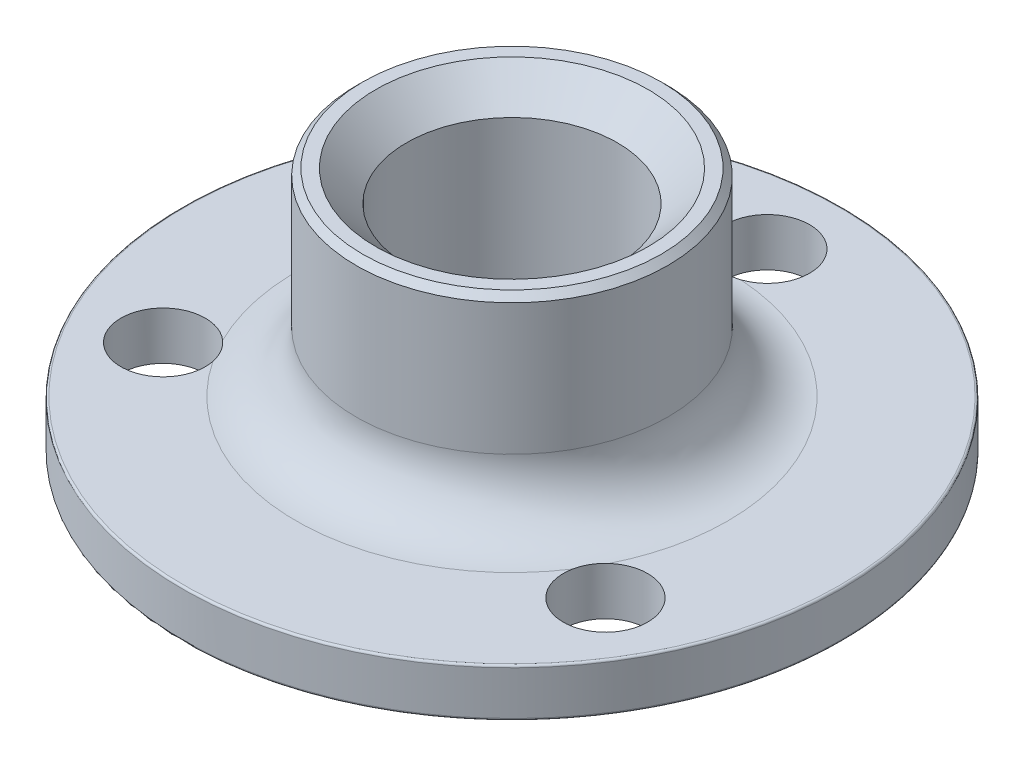
ISO-10303-21;
HEADER;
FILE_DESCRIPTION(('STEP AP214'),'2;1');
FILE_NAME('part.step','',(''),(''),'','','');
FILE_SCHEMA(('AUTOMOTIVE_DESIGN { 1 0 10303 214 1 1 1 1 }'));
ENDSEC;
DATA;
#1=APPLICATION_CONTEXT('core data for automotive mechanical design processes');
#2=APPLICATION_PROTOCOL_DEFINITION('international standard','automotive_design',2000,#1);
#3=PRODUCT_CONTEXT('',#1,'mechanical');
#4=PRODUCT('Part','Part','',(#3));
#5=PRODUCT_RELATED_PRODUCT_CATEGORY('part','',(#4));
#6=PRODUCT_DEFINITION_FORMATION('','',#4);
#7=PRODUCT_DEFINITION_CONTEXT('part definition',#1,'design');
#8=PRODUCT_DEFINITION('design','',#6,#7);
#9=PRODUCT_DEFINITION_SHAPE('','',#8);
#10=(LENGTH_UNIT() NAMED_UNIT(*) SI_UNIT(.MILLI.,.METRE.));
#11=(NAMED_UNIT(*) PLANE_ANGLE_UNIT() SI_UNIT($,.RADIAN.));
#12=(NAMED_UNIT(*) SI_UNIT($,.STERADIAN.) SOLID_ANGLE_UNIT());
#13=UNCERTAINTY_MEASURE_WITH_UNIT(LENGTH_MEASURE(1.E-05),#10,'distance_accuracy_value','');
#14=(GEOMETRIC_REPRESENTATION_CONTEXT(3) GLOBAL_UNCERTAINTY_ASSIGNED_CONTEXT((#13)) GLOBAL_UNIT_ASSIGNED_CONTEXT((#10,
#11,#12)) REPRESENTATION_CONTEXT('',''));
#15=CARTESIAN_POINT('',(0.,0.,0.));
#16=DIRECTION('',(0.,0.,1.));
#17=DIRECTION('',(1.,0.,0.));
#18=AXIS2_PLACEMENT_3D('',#15,#16,#17);
#19=CARTESIAN_POINT('',(0.,-0.717549999999995,0.));
#20=DIRECTION('',(0.,-1.,0.));
#21=DIRECTION('',(1.,0.,0.));
#22=AXIS2_PLACEMENT_3D('',#19,#20,#21);
#23=TOROIDAL_SURFACE('',#22,10.39495,2.88925);
#24=CARTESIAN_POINT('',(0.,-0.717549999999996,0.));
#25=DIRECTION('',(0.,-1.,0.));
#26=DIRECTION('',(1.,0.,0.));
#27=AXIS2_PLACEMENT_3D('',#24,#25,#26);
#28=CIRCLE('',#27,7.5057);
#29=CARTESIAN_POINT('',(7.5057,-0.717549999999995,0.));
#30=VERTEX_POINT('',#29);
#31=EDGE_CURVE('E101',#30,#30,#28,.T.);
#32=ORIENTED_EDGE('',*,*,#31,.T.);
#33=EDGE_LOOP('',(#32));
#34=FACE_BOUND('',#33,.T.);
#35=CARTESIAN_POINT('',(-0.699038911202562,-3.60670297944473,-10.3951500000001));
#36=CARTESIAN_POINT('',(-0.644625123533835,-3.60688135179927,-10.375207064648));
#37=CARTESIAN_POINT('',(-0.589355165590195,-3.60677808494333,-10.3576044859045));
#38=CARTESIAN_POINT('',(-0.477522624445641,-3.60630061340747,-10.3271830594659));
#39=CARTESIAN_POINT('',(-0.420960212432454,-3.60592644440985,-10.314363582094));
#40=CARTESIAN_POINT('',(-0.308585232071366,-3.60520984307511,-10.2939041640021));
#41=CARTESIAN_POINT('',(-0.252797786844004,-3.60486680787456,-10.2861260342643));
#42=CARTESIAN_POINT('',(-0.140769027838509,-3.6043595646744,-10.2752258010875));
#43=CARTESIAN_POINT('',(-0.0845277082129204,-3.60419535898244,-10.2721037577314));
#44=CARTESIAN_POINT('',(0.032584120620781,-3.60411234873903,-10.2704756651495));
#45=CARTESIAN_POINT('',(0.0934605160561535,-3.60421450381666,-10.2723640852411));
#46=CARTESIAN_POINT('',(0.214803724141637,-3.60466061490249,-10.281594074507));
#47=CARTESIAN_POINT('',(0.275270480870036,-3.60500460327867,-10.2889363736592));
#48=CARTESIAN_POINT('',(0.397221790344512,-3.60577101481073,-10.3093398557612));
#49=CARTESIAN_POINT('',(0.458677073452452,-3.60619559407451,-10.3225763792749));
#50=CARTESIAN_POINT('',(0.580103368203233,-3.6067558685005,-10.3546748685427));
#51=CARTESIAN_POINT('',(0.640074334559854,-3.60689155485934,-10.3735370057047));
#52=CARTESIAN_POINT('',(0.699038911202559,-3.60670297944473,-10.3951500000001));
#53=B_SPLINE_CURVE_WITH_KNOTS('',3,(#35,#36,#37,#38,#39,#40,#41,#42,#43,#44,#45,#46,#47,#48,#49,
#50,#51,#52),.UNSPECIFIED.,.F.,.F.,(4,2,2,2,2,2,2,2,4),(0.,0.173804306273878,0.347585723806384,
0.516375876102302,0.685168206475681,0.867635683791728,1.05012758798126,1.23845418499346,
1.42678652074876),.UNSPECIFIED.);
#54=CARTESIAN_POINT('',(-0.641738668822516,-3.60679999999999,-10.3751220225806));
#55=VERTEX_POINT('',#54);
#56=CARTESIAN_POINT('',(0.641738668822513,-3.60679999999999,-10.3751220225806));
#57=VERTEX_POINT('',#56);
#58=EDGE_CURVE('E62',#55,#57,#53,.T.);
#59=ORIENTED_EDGE('',*,*,#58,.F.);
#60=CARTESIAN_POINT('',(0.,-3.60679999999999,0.));
#61=DIRECTION('',(0.,-1.,0.));
#62=DIRECTION('',(1.,0.,0.));
#63=AXIS2_PLACEMENT_3D('',#60,#61,#62);
#64=CIRCLE('',#63,10.39495);
#65=CARTESIAN_POINT('',(-9.30598857332948,-3.60679999999999,4.63179902149922));
#66=VERTEX_POINT('',#65);
#67=EDGE_CURVE('E93',#66,#55,#64,.T.);
#68=ORIENTED_EDGE('',*,*,#67,.F.);
#69=CARTESIAN_POINT('',(-10.39515,-1.32516775605289,8.16690269868048));
#70=CARTESIAN_POINT('',(-10.3743685263919,-1.40887795772418,8.16420394407488));
#71=CARTESIAN_POINT('',(-10.3495590759793,-1.49147110282293,8.16070361178508));
#72=CARTESIAN_POINT('',(-10.2928273135894,-1.65398677668887,8.15127057625675));
#73=CARTESIAN_POINT('',(-10.2609091879206,-1.73391084555336,8.14533930288244));
#74=CARTESIAN_POINT('',(-10.1553445419097,-1.97032623566462,8.12253989195984));
#75=CARTESIAN_POINT('',(-10.0722202867577,-2.12221681988929,8.10068108393669));
#76=CARTESIAN_POINT('',(-9.89409294298795,-2.40236950083914,8.03801533549606));
#77=CARTESIAN_POINT('',(-9.80003785591703,-2.53148517610506,7.99836029846631));
#78=CARTESIAN_POINT('',(-9.65334647658652,-2.71211641950909,7.92049626430788));
#79=CARTESIAN_POINT('',(-9.60361147506809,-2.77005814471357,7.89154826226693));
#80=CARTESIAN_POINT('',(-9.50329825637222,-2.88118801003743,7.82684919751274));
#81=CARTESIAN_POINT('',(-9.45272053652818,-2.93437884369589,7.79110202606314));
#82=CARTESIAN_POINT('',(-9.33564558040954,-3.05175940821069,7.69945255960604));
#83=CARTESIAN_POINT('',(-9.26927787948656,-3.11395966661616,7.64076872000779));
#84=CARTESIAN_POINT('',(-9.1407062797776,-3.22748996719885,7.50982989655418));
#85=CARTESIAN_POINT('',(-9.078500511376,-3.27882491300018,7.43758106261758));
#86=CARTESIAN_POINT('',(-8.9618510286017,-3.36977350450899,7.27964104418815));
#87=CARTESIAN_POINT('',(-8.90745403068033,-3.4093180148702,7.19387491330998));
#88=CARTESIAN_POINT('',(-8.81081402695962,-3.47607962265982,7.01139647318019));
#89=CARTESIAN_POINT('',(-8.76856797662764,-3.50329980904505,6.91468691438294));
#90=CARTESIAN_POINT('',(-8.70235376140697,-3.54471437370805,6.7227710068073));
#91=CARTESIAN_POINT('',(-8.67708369615472,-3.55985989361741,6.62821135234147));
#92=CARTESIAN_POINT('',(-8.64037834928259,-3.58283784921619,6.4355912464614));
#93=CARTESIAN_POINT('',(-8.62894724234016,-3.59066807800319,6.33752974785593));
#94=CARTESIAN_POINT('',(-8.62027787629318,-3.60151611748984,6.13637080949568));
#95=CARTESIAN_POINT('',(-8.62366099076061,-3.60431614919233,6.03323593099274));
#96=CARTESIAN_POINT('',(-8.64600290017203,-3.60703722425548,5.82863120593506));
#97=CARTESIAN_POINT('',(-8.6649664949229,-3.60695738010082,5.72716188230677));
#98=CARTESIAN_POINT('',(-8.72039317176198,-3.60603401670753,5.51944985979781));
#99=CARTESIAN_POINT('',(-8.75825487624305,-3.60512361996353,5.41357800224657));
#100=CARTESIAN_POINT('',(-8.85089959844967,-3.60411056584059,5.20951107544351));
#101=CARTESIAN_POINT('',(-8.90568417494079,-3.60400798289244,5.11131671441032));
#102=CARTESIAN_POINT('',(-9.03185945658104,-3.60476163756627,4.92353080198515));
#103=CARTESIAN_POINT('',(-9.10354423467646,-3.6056360194151,4.83413673903364));
#104=CARTESIAN_POINT('',(-9.26094352914523,-3.60686946626325,4.66859748607653));
#105=CARTESIAN_POINT('',(-9.34666525325203,-3.60722826558954,4.59245914431782));
#106=CARTESIAN_POINT('',(-9.52976346270985,-3.60460190775242,4.45557897569437));
#107=CARTESIAN_POINT('',(-9.62715394628218,-3.60161269760421,4.39485591930367));
#108=CARTESIAN_POINT('',(-9.830318760787,-3.58870516752587,4.29086926018729));
#109=CARTESIAN_POINT('',(-9.93607516765113,-3.57880132386916,4.24756947860823));
#110=CARTESIAN_POINT('',(-10.1017136846212,-3.55565885793833,4.19534514641158));
#111=CARTESIAN_POINT('',(-10.1600957412204,-3.54610385426763,4.17979462768295));
#112=CARTESIAN_POINT('',(-10.2773957530172,-3.52362197045826,4.15401592405193));
#113=CARTESIAN_POINT('',(-10.3363138330337,-3.51069428449495,4.14378901285424));
#114=CARTESIAN_POINT('',(-10.3951499999999,-3.49587885705814,4.13622230131954));
#115=B_SPLINE_CURVE_WITH_KNOTS('',3,(#69,#70,#71,#72,#73,#74,#75,#76,#77,#78,#79,#80,#81,#82,
#83,#84,#85,#86,#87,#88,#89,#90,#91,#92,#93,#94,#95,#96,#97,#98,#99,#100,#101,#102,#103,#104,
#105,#106,#107,#108,#109,#110,#111,#112,#113,#114),.UNSPECIFIED.,.F.,.F.,(4,2,2,2,2,2,2,2,2,2,2,
2,2,2,2,2,2,2,2,2,2,2,4),(0.,0.258627882036687,0.517103858605673,1.03786271538546,
1.52891790137242,1.77354429615412,2.01803110667861,2.34141143931967,2.6646455145142,
2.98973925179036,3.31475146271423,3.61054046718633,3.90641867752321,4.21482351508023,
4.52332339713642,4.85909161277833,5.19489076525419,5.53703159455512,5.87934866146125,
6.22208057392144,6.56409709617972,6.74730811894538,6.93056295591203),.UNSPECIFIED.);
#116=CARTESIAN_POINT('',(-8.66424990450697,-3.60679999999999,5.74332300108143));
#117=VERTEX_POINT('',#116);
#118=EDGE_CURVE('E69',#117,#66,#115,.T.);
#119=ORIENTED_EDGE('',*,*,#118,.F.);
#120=CARTESIAN_POINT('',(8.66424990450697,-3.60679999999999,5.74332300108142));
#121=VERTEX_POINT('',#120);
#122=EDGE_CURVE('E92',#121,#117,#64,.T.);
#123=ORIENTED_EDGE('',*,*,#122,.F.);
#124=CARTESIAN_POINT('',(10.3951499999999,-3.49587885705814,4.13622230131953));
#125=CARTESIAN_POINT('',(10.344212732184,-3.5087039660119,4.14277216739067));
#126=CARTESIAN_POINT('',(10.2931905507332,-3.52012028444383,4.15132217902308));
#127=CARTESIAN_POINT('',(10.1914940820546,-3.5403799039437,4.17241233570946));
#128=CARTESIAN_POINT('',(10.1408195962564,-3.54922481830435,4.18494996855382));
#129=CARTESIAN_POINT('',(10.0405042201078,-3.56456601766516,4.21394603478827));
#130=CARTESIAN_POINT('',(9.99085962507414,-3.57107300908092,4.23038600715351));
#131=CARTESIAN_POINT('',(9.89280416822146,-3.58211061723898,4.26712541199733));
#132=CARTESIAN_POINT('',(9.8443934492594,-3.58664100610213,4.28742528909062));
#133=CARTESIAN_POINT('',(9.70178078335549,-3.59776212221341,4.35386974824209));
#134=CARTESIAN_POINT('',(9.60993603097394,-3.60191883771331,4.40563483130743));
#135=CARTESIAN_POINT('',(9.43528286072819,-3.60651485254248,4.52280440284422));
#136=CARTESIAN_POINT('',(9.35248383279635,-3.60695032455331,4.58822286308421));
#137=CARTESIAN_POINT('',(9.19366157764279,-3.60656071808991,4.73509673059334));
#138=CARTESIAN_POINT('',(9.1182768715149,-3.60566373059596,4.8172447388765));
#139=CARTESIAN_POINT('',(8.98194600679819,-3.60439790671641,4.99273903051551));
#140=CARTESIAN_POINT('',(8.92099899408791,-3.60402903908118,5.0860846509379));
#141=CARTESIAN_POINT('',(8.81369364237139,-3.60434295325588,5.28419947549487));
#142=CARTESIAN_POINT('',(8.76778732198609,-3.60505521729785,5.38921388891031));
#143=CARTESIAN_POINT('',(8.69423564622362,-3.60646995416851,5.60549309245051));
#144=CARTESIAN_POINT('',(8.66659700373702,-3.60717242330511,5.71676016398391));
#145=CARTESIAN_POINT('',(8.63037341724441,-3.60600720963472,5.94247184649286));
#146=CARTESIAN_POINT('',(8.62180658567028,-3.6041370863698,6.05691937361253));
#147=CARTESIAN_POINT('',(8.62401977570595,-3.59436606016821,6.2853758125004));
#148=CARTESIAN_POINT('',(8.63478942539688,-3.58646839166022,6.39938492655908));
#149=CARTESIAN_POINT('',(8.6741874105825,-3.56156727580656,6.61846462869247));
#150=CARTESIAN_POINT('',(8.70207296982064,-3.54494652117421,6.72371019351652));
#151=CARTESIAN_POINT('',(8.77322961835944,-3.50032224030122,6.9262522542291));
#152=CARTESIAN_POINT('',(8.81648795511609,-3.47232814610717,7.02355525687351));
#153=CARTESIAN_POINT('',(8.91066565406238,-3.40692337804083,7.19842123719789));
#154=CARTESIAN_POINT('',(8.96051953253198,-3.37061086952056,7.27697606905527));
#155=CARTESIAN_POINT('',(9.06726029724287,-3.28776655909767,7.42312737215979));
#156=CARTESIAN_POINT('',(9.12414883704129,-3.24123235249445,7.49072125827993));
#157=CARTESIAN_POINT('',(9.24307830755844,-3.13771145845192,7.61567335413502));
#158=CARTESIAN_POINT('',(9.30520346054631,-3.08052235582484,7.67278149852262));
#159=CARTESIAN_POINT('',(9.43054021293056,-2.95761820695505,7.77536593569752));
#160=CARTESIAN_POINT('',(9.49375234949411,-2.89189883366034,7.82083629009017));
#161=CARTESIAN_POINT('',(9.64898872227926,-2.71957930495926,7.92059360600571));
#162=CARTESIAN_POINT('',(9.74019372016429,-2.6085574817745,7.96854346510643));
#163=CARTESIAN_POINT('',(9.91324725312969,-2.37331370740081,8.04579547931258));
#164=CARTESIAN_POINT('',(9.99507000054968,-2.24905710395733,8.07504720421365));
#165=CARTESIAN_POINT('',(10.1404463925903,-1.99545569761011,8.11877803325811));
#166=CARTESIAN_POINT('',(10.2046597243861,-1.86659638259092,8.13386631493012));
#167=CARTESIAN_POINT('',(10.2871928288979,-1.66747516400894,8.15022733960612));
#168=CARTESIAN_POINT('',(10.3123750531051,-1.60024792693086,8.15463359811615));
#169=CARTESIAN_POINT('',(10.357689576495,-1.46399131315497,8.16184939924092));
#170=CARTESIAN_POINT('',(10.3778190847497,-1.39496096362508,8.16465806048334));
#171=CARTESIAN_POINT('',(10.39515,-1.32516775605294,8.16690269868046));
#172=B_SPLINE_CURVE_WITH_KNOTS('',3,(#124,#125,#126,#127,#128,#129,#130,#131,#132,#133,#134,
#135,#136,#137,#138,#139,#140,#141,#142,#143,#144,#145,#146,#147,#148,#149,#150,#151,#152,#153,
#154,#155,#156,#157,#158,#159,#160,#161,#162,#163,#164,#165,#166,#167,#168,#169,#170,#171),
.UNSPECIFIED.,.F.,.F.,(4,2,2,2,2,2,2,2,2,2,2,2,2,2,2,2,2,2,2,2,2,2,2,4),(0.,0.158727786543946,
0.317355771676596,0.475247778749525,0.633157984116389,0.948162735978176,1.2634914329336,
1.59646710980105,1.92942308319307,2.27162321487548,2.6139490262837,2.95659980487533,
3.29906684350124,3.6276304268744,3.95592208293744,4.25412596213601,4.55240007042064,
4.85705875715399,5.16187259299259,5.6138054550301,6.06695212584552,6.49957106629925,
6.71515288139804,6.93085351493704),.UNSPECIFIED.);
#173=CARTESIAN_POINT('',(9.30598857332949,-3.60679999999999,4.63179902149921));
#174=VERTEX_POINT('',#173);
#175=EDGE_CURVE('E144',#174,#121,#172,.T.);
#176=ORIENTED_EDGE('',*,*,#175,.F.);
#177=EDGE_CURVE('E103',#57,#174,#64,.T.);
#178=ORIENTED_EDGE('',*,*,#177,.F.);
#179=EDGE_LOOP('',(#59,#68,#119,#123,#176,#178));
#180=FACE_BOUND('',#179,.T.);
#181=ADVANCED_FACE('F47',(#34,#180),#23,.F.);
#182=CARTESIAN_POINT('',(0.,-3.02894999999999,0.));
#183=DIRECTION('',(0.,-1.,0.));
#184=DIRECTION('',(1.,0.,0.));
#185=AXIS2_PLACEMENT_3D('',#182,#183,#184);
#186=TOROIDAL_SURFACE('',#185,7.97018969676203,2.88925);
#187=CARTESIAN_POINT('',(0.,-3.02895,0.));
#188=DIRECTION('',(0.,-1.,0.));
#189=DIRECTION('',(1.,0.,0.));
#190=AXIS2_PLACEMENT_3D('',#187,#188,#189);
#191=CIRCLE('',#190,5.08093969676203);
#192=CARTESIAN_POINT('',(5.08093969676203,-3.02894999999999,0.));
#193=VERTEX_POINT('',#192);
#194=EDGE_CURVE('E243',#193,#193,#191,.T.);
#195=ORIENTED_EDGE('',*,*,#194,.F.);
#196=EDGE_LOOP('',(#195));
#197=FACE_BOUND('',#196,.T.);
#198=CARTESIAN_POINT('',(0.,-5.91819999999999,0.));
#199=DIRECTION('',(0.,-1.,0.));
#200=DIRECTION('',(1.,0.,0.));
#201=AXIS2_PLACEMENT_3D('',#198,#199,#200);
#202=CIRCLE('',#201,7.97018969676203);
#203=CARTESIAN_POINT('',(7.97018969676203,-5.91819999999999,0.));
#204=VERTEX_POINT('',#203);
#205=EDGE_CURVE('E111',#204,#204,#202,.T.);
#206=ORIENTED_EDGE('',*,*,#205,.T.);
#207=EDGE_LOOP('',(#206));
#208=FACE_BOUND('',#207,.T.);
#209=ADVANCED_FACE('F183',(#197,#208),#186,.T.);
#210=CARTESIAN_POINT('',(0.,-5.9182,0.));
#211=DIRECTION('',(0.,-1.,0.));
#212=DIRECTION('',(1.,0.,0.));
#213=AXIS2_PLACEMENT_3D('',#210,#211,#212);
#214=CYLINDRICAL_SURFACE('',#213,5.08093969676203);
#215=CARTESIAN_POINT('',(0.,4.43762964622238,0.));
#216=DIRECTION('',(0.,-1.,0.));
#217=DIRECTION('',(1.,0.,0.));
#218=AXIS2_PLACEMENT_3D('',#215,#216,#217);
#219=CIRCLE('',#218,5.08093969676203);
#220=CARTESIAN_POINT('',(5.08093969676202,4.43762964622239,0.));
#221=VERTEX_POINT('',#220);
#222=EDGE_CURVE('E247',#221,#221,#219,.T.);
#223=ORIENTED_EDGE('',*,*,#222,.F.);
#224=EDGE_LOOP('',(#223));
#225=FACE_BOUND('',#224,.T.);
#226=ORIENTED_EDGE('',*,*,#194,.T.);
#227=EDGE_LOOP('',(#226));
#228=FACE_BOUND('',#227,.T.);
#229=ADVANCED_FACE('F189',(#225,#228),#214,.F.);
#230=CARTESIAN_POINT('',(0.,4.43762964622238,0.));
#231=DIRECTION('',(0.,1.,0.));
#232=DIRECTION('',(-1.,0.,0.));
#233=AXIS2_PLACEMENT_3D('',#230,#231,#232);
#234=CONICAL_SURFACE('',#233,5.08093969676203,0.785398163397451);
#235=CARTESIAN_POINT('',(0.,5.91820000000001,0.));
#236=DIRECTION('',(0.,-1.,0.));
#237=DIRECTION('',(1.,0.,0.));
#238=AXIS2_PLACEMENT_3D('',#235,#236,#237);
#239=CIRCLE('',#238,6.56151005053966);
#240=CARTESIAN_POINT('',(6.56151005053965,5.91820000000001,0.));
#241=VERTEX_POINT('',#240);
#242=EDGE_CURVE('E107',#241,#241,#239,.T.);
#243=ORIENTED_EDGE('',*,*,#242,.F.);
#244=EDGE_LOOP('',(#243));
#245=FACE_BOUND('',#244,.T.);
#246=ORIENTED_EDGE('',*,*,#222,.T.);
#247=EDGE_LOOP('',(#246));
#248=FACE_BOUND('',#247,.T.);
#249=ADVANCED_FACE('F204',(#245,#248),#234,.F.);
#250=CARTESIAN_POINT('',(-6.56151005053966,5.91820000000001,0.));
#251=DIRECTION('',(0.,-1.,0.));
#252=DIRECTION('',(1.,0.,0.));
#253=AXIS2_PLACEMENT_3D('',#250,#251,#252);
#254=PLANE('',#253);
#255=CARTESIAN_POINT('',(0.,5.91820000000001,0.));
#256=DIRECTION('',(0.,-1.,0.));
#257=DIRECTION('',(1.,0.,0.));
#258=AXIS2_PLACEMENT_3D('',#255,#256,#257);
#259=CIRCLE('',#258,7.19097001684587);
#260=CARTESIAN_POINT('',(7.19097001684587,5.91820000000001,0.));
#261=VERTEX_POINT('',#260);
#262=EDGE_CURVE('E11',#261,#261,#259,.F.);
#263=ORIENTED_EDGE('',*,*,#262,.T.);
#264=EDGE_LOOP('',(#263));
#265=FACE_BOUND('',#264,.T.);
#266=ORIENTED_EDGE('',*,*,#242,.T.);
#267=EDGE_LOOP('',(#266));
#268=FACE_BOUND('',#267,.T.);
#269=ADVANCED_FACE('F196',(#265,#268),#254,.F.);
#270=CARTESIAN_POINT('',(0.,-5.9182,0.));
#271=DIRECTION('',(0.,-1.,0.));
#272=DIRECTION('',(1.,0.,0.));
#273=AXIS2_PLACEMENT_3D('',#270,#271,#272);
#274=CYLINDRICAL_SURFACE('',#273,7.5057);
#275=CARTESIAN_POINT('',(0.,5.60347001684587,0.));
#276=DIRECTION('',(0.,-1.,0.));
#277=DIRECTION('',(1.,0.,0.));
#278=AXIS2_PLACEMENT_3D('',#275,#276,#277);
#279=CIRCLE('',#278,7.5057);
#280=CARTESIAN_POINT('',(7.5057,5.60347001684587,0.));
#281=VERTEX_POINT('',#280);
#282=EDGE_CURVE('E56',#281,#281,#279,.T.);
#283=ORIENTED_EDGE('',*,*,#282,.T.);
#284=EDGE_LOOP('',(#283));
#285=FACE_BOUND('',#284,.T.);
#286=ORIENTED_EDGE('',*,*,#31,.F.);
#287=EDGE_LOOP('',(#286));
#288=FACE_BOUND('',#287,.T.);
#289=ADVANCED_FACE('F194',(#285,#288),#274,.T.);
#290=CARTESIAN_POINT('',(-10.39495,-3.6068,0.));
#291=DIRECTION('',(0.,-1.,0.));
#292=DIRECTION('',(1.,0.,0.));
#293=AXIS2_PLACEMENT_3D('',#290,#291,#292);
#294=PLANE('',#293);
#295=CARTESIAN_POINT('',(0.,-3.60679999999999,0.));
#296=DIRECTION('',(0.,-1.,0.));
#297=DIRECTION('',(1.,0.,0.));
#298=AXIS2_PLACEMENT_3D('',#295,#296,#297);
#299=CIRCLE('',#298,15.77578125);
#300=CARTESIAN_POINT('',(15.77578125,-3.60679999999999,0.));
#301=VERTEX_POINT('',#300);
#302=EDGE_CURVE('E230',#301,#301,#299,.F.);
#303=ORIENTED_EDGE('',*,*,#302,.T.);
#304=EDGE_LOOP('',(#303));
#305=FACE_BOUND('',#304,.T.);
#306=CARTESIAN_POINT('',(0.,-3.60679999999999,-12.303125));
#307=DIRECTION('',(0.,-1.,0.));
#308=DIRECTION('',(1.,0.,0.));
#309=AXIS2_PLACEMENT_3D('',#306,#307,#308);
#310=CIRCLE('',#309,2.032);
#311=EDGE_CURVE('E118',#57,#55,#310,.F.);
#312=ORIENTED_EDGE('',*,*,#311,.F.);
#313=ORIENTED_EDGE('',*,*,#177,.T.);
#314=CARTESIAN_POINT('',(10.6548187959354,-3.60679999999999,6.15156249999999));
#315=DIRECTION('',(0.,-1.,0.));
#316=DIRECTION('',(1.,0.,0.));
#317=AXIS2_PLACEMENT_3D('',#314,#315,#316);
#318=CIRCLE('',#317,2.032);
#319=EDGE_CURVE('E95',#121,#174,#318,.F.);
#320=ORIENTED_EDGE('',*,*,#319,.F.);
#321=ORIENTED_EDGE('',*,*,#122,.T.);
#322=CARTESIAN_POINT('',(-10.6548187959354,-3.60679999999999,6.15156250000001));
#323=DIRECTION('',(0.,-1.,0.));
#324=DIRECTION('',(1.,0.,0.));
#325=AXIS2_PLACEMENT_3D('',#322,#323,#324);
#326=CIRCLE('',#325,2.032);
#327=EDGE_CURVE('E80',#66,#117,#326,.F.);
#328=ORIENTED_EDGE('',*,*,#327,.F.);
#329=ORIENTED_EDGE('',*,*,#67,.T.);
#330=EDGE_LOOP('',(#312,#313,#320,#321,#328,#329));
#331=FACE_BOUND('',#330,.T.);
#332=ADVANCED_FACE('F98',(#305,#331),#294,.F.);
#333=CARTESIAN_POINT('',(0.,-5.9182,0.));
#334=DIRECTION('',(0.,-1.,0.));
#335=DIRECTION('',(1.,0.,0.));
#336=AXIS2_PLACEMENT_3D('',#333,#334,#335);
#337=CYLINDRICAL_SURFACE('',#336,15.875);
#338=CARTESIAN_POINT('',(0.,-3.70601874999999,0.));
#339=DIRECTION('',(0.,-1.,0.));
#340=DIRECTION('',(1.,0.,0.));
#341=AXIS2_PLACEMENT_3D('',#338,#339,#340);
#342=CIRCLE('',#341,15.875);
#343=CARTESIAN_POINT('',(15.875,-3.70601874999999,0.));
#344=VERTEX_POINT('',#343);
#345=EDGE_CURVE('E235',#344,#344,#342,.T.);
#346=ORIENTED_EDGE('',*,*,#345,.T.);
#347=EDGE_LOOP('',(#346));
#348=FACE_BOUND('',#347,.T.);
#349=CARTESIAN_POINT('',(0.,-5.81898124999999,0.));
#350=DIRECTION('',(0.,1.,0.));
#351=DIRECTION('',(-1.,0.,0.));
#352=AXIS2_PLACEMENT_3D('',#349,#350,#351);
#353=CIRCLE('',#352,15.875);
#354=CARTESIAN_POINT('',(-15.875,-5.81898125,0.));
#355=VERTEX_POINT('',#354);
#356=EDGE_CURVE('E225',#355,#355,#353,.T.);
#357=ORIENTED_EDGE('',*,*,#356,.T.);
#358=EDGE_LOOP('',(#357));
#359=FACE_BOUND('',#358,.T.);
#360=ADVANCED_FACE('F172',(#348,#359),#337,.T.);
#361=CARTESIAN_POINT('',(-15.875,-5.9182,0.));
#362=DIRECTION('',(0.,1.,0.));
#363=DIRECTION('',(-1.,0.,0.));
#364=AXIS2_PLACEMENT_3D('',#361,#362,#363);
#365=PLANE('',#364);
#366=CARTESIAN_POINT('',(0.,-5.91819999999999,0.));
#367=DIRECTION('',(0.,1.,0.));
#368=DIRECTION('',(-1.,0.,0.));
#369=AXIS2_PLACEMENT_3D('',#366,#367,#368);
#370=CIRCLE('',#369,15.77578125);
#371=CARTESIAN_POINT('',(-15.77578125,-5.9182,0.));
#372=VERTEX_POINT('',#371);
#373=EDGE_CURVE('E228',#372,#372,#370,.F.);
#374=ORIENTED_EDGE('',*,*,#373,.T.);
#375=EDGE_LOOP('',(#374));
#376=FACE_BOUND('',#375,.T.);
#377=CARTESIAN_POINT('',(0.,-5.91819999999999,-12.303125));
#378=DIRECTION('',(0.,1.,0.));
#379=DIRECTION('',(0.,0.,1.));
#380=AXIS2_PLACEMENT_3D('',#377,#378,#379);
#381=CIRCLE('',#380,2.032);
#382=CARTESIAN_POINT('',(0.,-5.91819999999999,-10.271125));
#383=VERTEX_POINT('',#382);
#384=EDGE_CURVE('E87',#383,#383,#381,.T.);
#385=ORIENTED_EDGE('',*,*,#384,.T.);
#386=EDGE_LOOP('',(#385));
#387=FACE_BOUND('',#386,.T.);
#388=CARTESIAN_POINT('',(10.6548187959354,-5.91819999999999,6.15156249999999));
#389=DIRECTION('',(0.,1.,0.));
#390=DIRECTION('',(0.,0.,1.));
#391=AXIS2_PLACEMENT_3D('',#388,#389,#390);
#392=CIRCLE('',#391,2.032);
#393=CARTESIAN_POINT('',(10.6548187959354,-5.91819999999999,8.18356249999999));
#394=VERTEX_POINT('',#393);
#395=EDGE_CURVE('E161',#394,#394,#392,.T.);
#396=ORIENTED_EDGE('',*,*,#395,.T.);
#397=EDGE_LOOP('',(#396));
#398=FACE_BOUND('',#397,.T.);
#399=CARTESIAN_POINT('',(-10.6548187959354,-5.91819999999999,6.15156250000001));
#400=DIRECTION('',(0.,1.,0.));
#401=DIRECTION('',(0.,0.,1.));
#402=AXIS2_PLACEMENT_3D('',#399,#400,#401);
#403=CIRCLE('',#402,2.032);
#404=CARTESIAN_POINT('',(-10.6548187959354,-5.91819999999999,8.1835625));
#405=VERTEX_POINT('',#404);
#406=EDGE_CURVE('E157',#405,#405,#403,.T.);
#407=ORIENTED_EDGE('',*,*,#406,.T.);
#408=EDGE_LOOP('',(#407));
#409=FACE_BOUND('',#408,.T.);
#410=ORIENTED_EDGE('',*,*,#205,.F.);
#411=EDGE_LOOP('',(#410));
#412=FACE_BOUND('',#411,.T.);
#413=ADVANCED_FACE('F169',(#376,#387,#398,#409,#412),#365,.F.);
#414=CARTESIAN_POINT('',(-10.6548187959354,5.91820000000001,6.15156250000001));
#415=DIRECTION('',(0.,-1.,0.));
#416=DIRECTION('',(0.,0.,-1.));
#417=AXIS2_PLACEMENT_3D('',#414,#415,#416);
#418=CYLINDRICAL_SURFACE('',#417,2.032);
#419=ORIENTED_EDGE('',*,*,#406,.F.);
#420=EDGE_LOOP('',(#419));
#421=FACE_BOUND('',#420,.T.);
#422=ORIENTED_EDGE('',*,*,#118,.T.);
#423=ORIENTED_EDGE('',*,*,#327,.T.);
#424=EDGE_LOOP('',(#422,#423));
#425=FACE_BOUND('',#424,.T.);
#426=ADVANCED_FACE('F81',(#421,#425),#418,.F.);
#427=CARTESIAN_POINT('',(10.6548187959354,5.91820000000001,6.15156249999999));
#428=DIRECTION('',(0.,-1.,0.));
#429=DIRECTION('',(0.,0.,-1.));
#430=AXIS2_PLACEMENT_3D('',#427,#428,#429);
#431=CYLINDRICAL_SURFACE('',#430,2.032);
#432=ORIENTED_EDGE('',*,*,#395,.F.);
#433=EDGE_LOOP('',(#432));
#434=FACE_BOUND('',#433,.T.);
#435=ORIENTED_EDGE('',*,*,#175,.T.);
#436=ORIENTED_EDGE('',*,*,#319,.T.);
#437=EDGE_LOOP('',(#435,#436));
#438=FACE_BOUND('',#437,.T.);
#439=ADVANCED_FACE('F136',(#434,#438),#431,.F.);
#440=CARTESIAN_POINT('',(0.,5.91820000000001,-12.303125));
#441=DIRECTION('',(0.,-1.,0.));
#442=DIRECTION('',(0.,0.,-1.));
#443=AXIS2_PLACEMENT_3D('',#440,#441,#442);
#444=CYLINDRICAL_SURFACE('',#443,2.032);
#445=ORIENTED_EDGE('',*,*,#384,.F.);
#446=EDGE_LOOP('',(#445));
#447=FACE_BOUND('',#446,.T.);
#448=ORIENTED_EDGE('',*,*,#58,.T.);
#449=ORIENTED_EDGE('',*,*,#311,.T.);
#450=EDGE_LOOP('',(#448,#449));
#451=FACE_BOUND('',#450,.T.);
#452=ADVANCED_FACE('F131',(#447,#451),#444,.F.);
#453=CARTESIAN_POINT('',(0.,-3.70601874999999,0.));
#454=DIRECTION('',(0.,-1.,0.));
#455=DIRECTION('',(1.,0.,0.));
#456=AXIS2_PLACEMENT_3D('',#453,#454,#455);
#457=TOROIDAL_SURFACE('',#456,15.77578125,0.09921875);
#458=ORIENTED_EDGE('',*,*,#302,.F.);
#459=EDGE_LOOP('',(#458));
#460=FACE_BOUND('',#459,.T.);
#461=ORIENTED_EDGE('',*,*,#345,.F.);
#462=EDGE_LOOP('',(#461));
#463=FACE_BOUND('',#462,.T.);
#464=ADVANCED_FACE('F135',(#460,#463),#457,.T.);
#465=CARTESIAN_POINT('',(0.,-5.81898124999999,0.));
#466=DIRECTION('',(0.,1.,0.));
#467=DIRECTION('',(-1.,0.,0.));
#468=AXIS2_PLACEMENT_3D('',#465,#466,#467);
#469=TOROIDAL_SURFACE('',#468,15.77578125,0.09921875);
#470=ORIENTED_EDGE('',*,*,#356,.F.);
#471=EDGE_LOOP('',(#470));
#472=FACE_BOUND('',#471,.T.);
#473=ORIENTED_EDGE('',*,*,#373,.F.);
#474=EDGE_LOOP('',(#473));
#475=FACE_BOUND('',#474,.T.);
#476=ADVANCED_FACE('F215',(#472,#475),#469,.T.);
#477=CARTESIAN_POINT('',(0.,5.60347001684587,0.));
#478=DIRECTION('',(0.,-1.,0.));
#479=DIRECTION('',(1.,0.,0.));
#480=AXIS2_PLACEMENT_3D('',#477,#478,#479);
#481=CONICAL_SURFACE('',#480,7.5057,0.78539816339744);
#482=ORIENTED_EDGE('',*,*,#262,.F.);
#483=EDGE_LOOP('',(#482));
#484=FACE_BOUND('',#483,.T.);
#485=ORIENTED_EDGE('',*,*,#282,.F.);
#486=EDGE_LOOP('',(#485));
#487=FACE_BOUND('',#486,.T.);
#488=ADVANCED_FACE('F49',(#484,#487),#481,.T.);
#489=CLOSED_SHELL('',(#181,#209,#229,#249,#269,#289,#332,#360,#413,#426,#439,#452,#464,#476,#488));
#490=MANIFOLD_SOLID_BREP('B2',#489);
#491=ADVANCED_BREP_SHAPE_REPRESENTATION('',(#18,#490),#14);
#492=SHAPE_DEFINITION_REPRESENTATION(#9,#491);
ENDSEC;
END-ISO-10303-21;
